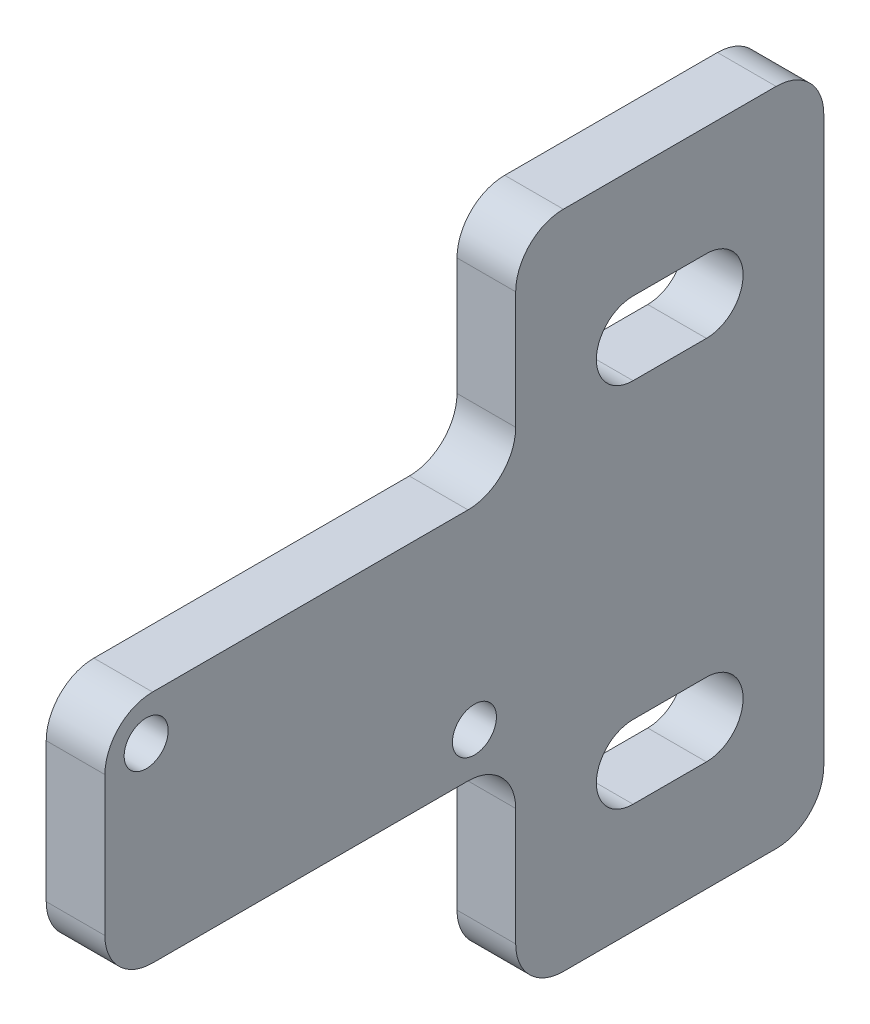
ISO-10303-21;
HEADER;
FILE_DESCRIPTION(('STEP AP214'),'2;1');
FILE_NAME('part.step','',(''),(''),'','','');
FILE_SCHEMA(('AUTOMOTIVE_DESIGN { 1 0 10303 214 1 1 1 1 }'));
ENDSEC;
DATA;
#1=APPLICATION_CONTEXT('core data for automotive mechanical design processes');
#2=APPLICATION_PROTOCOL_DEFINITION('international standard','automotive_design',2000,#1);
#3=PRODUCT_CONTEXT('',#1,'mechanical');
#4=PRODUCT('Part','Part','',(#3));
#5=PRODUCT_RELATED_PRODUCT_CATEGORY('part','',(#4));
#6=PRODUCT_DEFINITION_FORMATION('','',#4);
#7=PRODUCT_DEFINITION_CONTEXT('part definition',#1,'design');
#8=PRODUCT_DEFINITION('design','',#6,#7);
#9=PRODUCT_DEFINITION_SHAPE('','',#8);
#10=(LENGTH_UNIT() NAMED_UNIT(*) SI_UNIT(.MILLI.,.METRE.));
#11=(NAMED_UNIT(*) PLANE_ANGLE_UNIT() SI_UNIT($,.RADIAN.));
#12=(NAMED_UNIT(*) SI_UNIT($,.STERADIAN.) SOLID_ANGLE_UNIT());
#13=UNCERTAINTY_MEASURE_WITH_UNIT(LENGTH_MEASURE(1.E-05),#10,'distance_accuracy_value','');
#14=(GEOMETRIC_REPRESENTATION_CONTEXT(3) GLOBAL_UNCERTAINTY_ASSIGNED_CONTEXT((#13)) GLOBAL_UNIT_ASSIGNED_CONTEXT((#10,
#11,#12)) REPRESENTATION_CONTEXT('',''));
#15=CARTESIAN_POINT('',(0.,0.,0.));
#16=DIRECTION('',(0.,0.,1.));
#17=DIRECTION('',(1.,0.,0.));
#18=AXIS2_PLACEMENT_3D('',#15,#16,#17);
#19=CARTESIAN_POINT('',(4.,-4.5,-13.));
#20=DIRECTION('',(-1.,0.,0.));
#21=DIRECTION('',(0.,0.,1.));
#22=AXIS2_PLACEMENT_3D('',#19,#20,#21);
#23=CYLINDRICAL_SURFACE('',#22,2.5);
#24=CARTESIAN_POINT('',(0.,-4.5,-13.));
#25=DIRECTION('',(1.,0.,0.));
#26=DIRECTION('',(0.,0.,-1.));
#27=AXIS2_PLACEMENT_3D('',#24,#25,#26);
#28=CIRCLE('',#27,2.5);
#29=CARTESIAN_POINT('',(0.,-7.,-13.));
#30=VERTEX_POINT('',#29);
#31=CARTESIAN_POINT('',(0.,-2.,-13.));
#32=VERTEX_POINT('',#31);
#33=EDGE_CURVE('E312',#30,#32,#28,.T.);
#34=ORIENTED_EDGE('',*,*,#33,.F.);
#35=DIRECTION('',(-1.,0.,0.));
#36=VECTOR('',#35,1.);
#37=CARTESIAN_POINT('',(4.,-7.,-13.));
#38=LINE('',#37,#36);
#39=CARTESIAN_POINT('',(4.,-7.,-13.));
#40=VERTEX_POINT('',#39);
#41=EDGE_CURVE('E337',#40,#30,#38,.T.);
#42=ORIENTED_EDGE('',*,*,#41,.F.);
#43=CARTESIAN_POINT('',(4.,-4.5,-13.));
#44=DIRECTION('',(1.,0.,0.));
#45=DIRECTION('',(0.,0.,-1.));
#46=AXIS2_PLACEMENT_3D('',#43,#44,#45);
#47=CIRCLE('',#46,2.5);
#48=CARTESIAN_POINT('',(4.,-2.,-13.));
#49=VERTEX_POINT('',#48);
#50=EDGE_CURVE('E247',#40,#49,#47,.T.);
#51=ORIENTED_EDGE('',*,*,#50,.T.);
#52=DIRECTION('',(-1.,0.,0.));
#53=VECTOR('',#52,1.);
#54=CARTESIAN_POINT('',(4.,-2.,-13.));
#55=LINE('',#54,#53);
#56=EDGE_CURVE('E221',#49,#32,#55,.T.);
#57=ORIENTED_EDGE('',*,*,#56,.T.);
#58=EDGE_LOOP('',(#34,#42,#51,#57));
#59=FACE_BOUND('',#58,.T.);
#60=ADVANCED_FACE('F47',(#59),#23,.F.);
#61=CARTESIAN_POINT('',(4.,-7.,0.));
#62=DIRECTION('',(0.,1.,0.));
#63=DIRECTION('',(0.,0.,1.));
#64=AXIS2_PLACEMENT_3D('',#61,#62,#63);
#65=PLANE('',#64);
#66=DIRECTION('',(0.,0.,-1.));
#67=VECTOR('',#66,1.);
#68=CARTESIAN_POINT('',(0.,-7.,0.));
#69=LINE('',#68,#67);
#70=CARTESIAN_POINT('',(0.,-7.,-8.));
#71=VERTEX_POINT('',#70);
#72=EDGE_CURVE('E316',#71,#30,#69,.T.);
#73=ORIENTED_EDGE('',*,*,#72,.F.);
#74=DIRECTION('',(-1.,0.,0.));
#75=VECTOR('',#74,1.);
#76=CARTESIAN_POINT('',(4.,-7.,-8.));
#77=LINE('',#76,#75);
#78=CARTESIAN_POINT('',(4.,-7.,-8.));
#79=VERTEX_POINT('',#78);
#80=EDGE_CURVE('E334',#79,#71,#77,.T.);
#81=ORIENTED_EDGE('',*,*,#80,.F.);
#82=DIRECTION('',(0.,0.,-1.));
#83=VECTOR('',#82,1.);
#84=CARTESIAN_POINT('',(4.,-7.,0.));
#85=LINE('',#84,#83);
#86=EDGE_CURVE('E251',#79,#40,#85,.T.);
#87=ORIENTED_EDGE('',*,*,#86,.T.);
#88=ORIENTED_EDGE('',*,*,#41,.T.);
#89=EDGE_LOOP('',(#73,#81,#87,#88));
#90=FACE_BOUND('',#89,.T.);
#91=ADVANCED_FACE('F543',(#90),#65,.T.);
#92=CARTESIAN_POINT('',(4.,-4.5,-8.));
#93=DIRECTION('',(-1.,0.,0.));
#94=DIRECTION('',(0.,0.,1.));
#95=AXIS2_PLACEMENT_3D('',#92,#93,#94);
#96=CYLINDRICAL_SURFACE('',#95,2.5);
#97=CARTESIAN_POINT('',(0.,-4.5,-8.));
#98=DIRECTION('',(1.,0.,0.));
#99=DIRECTION('',(0.,0.,-1.));
#100=AXIS2_PLACEMENT_3D('',#97,#98,#99);
#101=CIRCLE('',#100,2.5);
#102=CARTESIAN_POINT('',(0.,-2.,-8.));
#103=VERTEX_POINT('',#102);
#104=EDGE_CURVE('E320',#103,#71,#101,.T.);
#105=ORIENTED_EDGE('',*,*,#104,.F.);
#106=DIRECTION('',(-1.,0.,0.));
#107=VECTOR('',#106,1.);
#108=CARTESIAN_POINT('',(4.,-2.,-8.));
#109=LINE('',#108,#107);
#110=CARTESIAN_POINT('',(4.,-2.,-8.));
#111=VERTEX_POINT('',#110);
#112=EDGE_CURVE('E331',#111,#103,#109,.T.);
#113=ORIENTED_EDGE('',*,*,#112,.F.);
#114=CARTESIAN_POINT('',(4.,-4.5,-8.));
#115=DIRECTION('',(1.,0.,0.));
#116=DIRECTION('',(0.,0.,-1.));
#117=AXIS2_PLACEMENT_3D('',#114,#115,#116);
#118=CIRCLE('',#117,2.5);
#119=EDGE_CURVE('E255',#111,#79,#118,.T.);
#120=ORIENTED_EDGE('',*,*,#119,.T.);
#121=ORIENTED_EDGE('',*,*,#80,.T.);
#122=EDGE_LOOP('',(#105,#113,#120,#121));
#123=FACE_BOUND('',#122,.T.);
#124=ADVANCED_FACE('F549',(#123),#96,.F.);
#125=CARTESIAN_POINT('',(4.,20.5,-13.));
#126=DIRECTION('',(-1.,0.,0.));
#127=DIRECTION('',(0.,0.,1.));
#128=AXIS2_PLACEMENT_3D('',#125,#126,#127);
#129=CYLINDRICAL_SURFACE('',#128,2.50000000000001);
#130=CARTESIAN_POINT('',(0.,20.5,-13.));
#131=DIRECTION('',(1.,0.,0.));
#132=DIRECTION('',(0.,0.,-1.));
#133=AXIS2_PLACEMENT_3D('',#130,#131,#132);
#134=CIRCLE('',#133,2.50000000000001);
#135=CARTESIAN_POINT('',(0.,18.,-13.));
#136=VERTEX_POINT('',#135);
#137=CARTESIAN_POINT('',(0.,23.,-13.));
#138=VERTEX_POINT('',#137);
#139=EDGE_CURVE('E215',#136,#138,#134,.T.);
#140=ORIENTED_EDGE('',*,*,#139,.F.);
#141=DIRECTION('',(-1.,0.,0.));
#142=VECTOR('',#141,1.);
#143=CARTESIAN_POINT('',(4.,18.,-13.));
#144=LINE('',#143,#142);
#145=CARTESIAN_POINT('',(4.,18.,-13.));
#146=VERTEX_POINT('',#145);
#147=EDGE_CURVE('E210',#146,#136,#144,.T.);
#148=ORIENTED_EDGE('',*,*,#147,.F.);
#149=CARTESIAN_POINT('',(4.,20.5,-13.));
#150=DIRECTION('',(1.,0.,0.));
#151=DIRECTION('',(0.,0.,-1.));
#152=AXIS2_PLACEMENT_3D('',#149,#150,#151);
#153=CIRCLE('',#152,2.50000000000001);
#154=CARTESIAN_POINT('',(4.,23.,-13.));
#155=VERTEX_POINT('',#154);
#156=EDGE_CURVE('E213',#146,#155,#153,.T.);
#157=ORIENTED_EDGE('',*,*,#156,.T.);
#158=DIRECTION('',(-1.,0.,0.));
#159=VECTOR('',#158,1.);
#160=CARTESIAN_POINT('',(4.,23.,-13.));
#161=LINE('',#160,#159);
#162=EDGE_CURVE('E262',#155,#138,#161,.T.);
#163=ORIENTED_EDGE('',*,*,#162,.T.);
#164=EDGE_LOOP('',(#140,#148,#157,#163));
#165=FACE_BOUND('',#164,.T.);
#166=ADVANCED_FACE('F212',(#165),#129,.F.);
#167=CARTESIAN_POINT('',(4.,18.,0.));
#168=DIRECTION('',(0.,1.,0.));
#169=DIRECTION('',(0.,0.,1.));
#170=AXIS2_PLACEMENT_3D('',#167,#168,#169);
#171=PLANE('',#170);
#172=DIRECTION('',(0.,0.,-1.));
#173=VECTOR('',#172,1.);
#174=CARTESIAN_POINT('',(0.,18.,0.));
#175=LINE('',#174,#173);
#176=CARTESIAN_POINT('',(0.,18.,-8.));
#177=VERTEX_POINT('',#176);
#178=EDGE_CURVE('E301',#177,#136,#175,.T.);
#179=ORIENTED_EDGE('',*,*,#178,.F.);
#180=DIRECTION('',(-1.,0.,0.));
#181=VECTOR('',#180,1.);
#182=CARTESIAN_POINT('',(4.,18.,-8.));
#183=LINE('',#182,#181);
#184=CARTESIAN_POINT('',(4.,18.,-8.));
#185=VERTEX_POINT('',#184);
#186=EDGE_CURVE('E222',#185,#177,#183,.T.);
#187=ORIENTED_EDGE('',*,*,#186,.F.);
#188=DIRECTION('',(0.,0.,-1.));
#189=VECTOR('',#188,1.);
#190=CARTESIAN_POINT('',(4.,18.,0.));
#191=LINE('',#190,#189);
#192=EDGE_CURVE('E229',#185,#146,#191,.T.);
#193=ORIENTED_EDGE('',*,*,#192,.T.);
#194=ORIENTED_EDGE('',*,*,#147,.T.);
#195=EDGE_LOOP('',(#179,#187,#193,#194));
#196=FACE_BOUND('',#195,.T.);
#197=ADVANCED_FACE('F237',(#196),#171,.T.);
#198=CARTESIAN_POINT('',(4.,20.5,-8.));
#199=DIRECTION('',(-1.,0.,0.));
#200=DIRECTION('',(0.,0.,1.));
#201=AXIS2_PLACEMENT_3D('',#198,#199,#200);
#202=CYLINDRICAL_SURFACE('',#201,2.50000000000001);
#203=CARTESIAN_POINT('',(0.,20.5,-8.));
#204=DIRECTION('',(1.,0.,0.));
#205=DIRECTION('',(0.,0.,-1.));
#206=AXIS2_PLACEMENT_3D('',#203,#204,#205);
#207=CIRCLE('',#206,2.50000000000001);
#208=CARTESIAN_POINT('',(0.,23.,-8.));
#209=VERTEX_POINT('',#208);
#210=EDGE_CURVE('E304',#209,#177,#207,.T.);
#211=ORIENTED_EDGE('',*,*,#210,.F.);
#212=DIRECTION('',(-1.,0.,0.));
#213=VECTOR('',#212,1.);
#214=CARTESIAN_POINT('',(4.,23.,-8.));
#215=LINE('',#214,#213);
#216=CARTESIAN_POINT('',(4.,23.,-8.));
#217=VERTEX_POINT('',#216);
#218=EDGE_CURVE('E343',#217,#209,#215,.T.);
#219=ORIENTED_EDGE('',*,*,#218,.F.);
#220=CARTESIAN_POINT('',(4.,20.5,-8.));
#221=DIRECTION('',(1.,0.,0.));
#222=DIRECTION('',(0.,0.,-1.));
#223=AXIS2_PLACEMENT_3D('',#220,#221,#222);
#224=CIRCLE('',#223,2.50000000000001);
#225=EDGE_CURVE('E239',#217,#185,#224,.T.);
#226=ORIENTED_EDGE('',*,*,#225,.T.);
#227=ORIENTED_EDGE('',*,*,#186,.T.);
#228=EDGE_LOOP('',(#211,#219,#226,#227));
#229=FACE_BOUND('',#228,.T.);
#230=ADVANCED_FACE('F559',(#229),#202,.F.);
#231=CARTESIAN_POINT('',(4.,0.,0.));
#232=DIRECTION('',(0.,-1.,0.));
#233=DIRECTION('',(0.,0.,-1.));
#234=AXIS2_PLACEMENT_3D('',#231,#232,#233);
#235=PLANE('',#234);
#236=DIRECTION('',(0.,0.,1.));
#237=VECTOR('',#236,1.);
#238=CARTESIAN_POINT('',(4.,0.,0.));
#239=LINE('',#238,#237);
#240=CARTESIAN_POINT('',(4.,0.,3.25));
#241=VERTEX_POINT('',#240);
#242=CARTESIAN_POINT('',(4.,0.,24.75));
#243=VERTEX_POINT('',#242);
#244=EDGE_CURVE('E463',#241,#243,#239,.T.);
#245=ORIENTED_EDGE('',*,*,#244,.T.);
#246=DIRECTION('',(-1.,0.,0.));
#247=VECTOR('',#246,1.);
#248=CARTESIAN_POINT('',(4.,0.,24.75));
#249=LINE('',#248,#247);
#250=CARTESIAN_POINT('',(0.,0.,24.75));
#251=VERTEX_POINT('',#250);
#252=EDGE_CURVE('E350',#243,#251,#249,.T.);
#253=ORIENTED_EDGE('',*,*,#252,.T.);
#254=DIRECTION('',(0.,0.,1.));
#255=VECTOR('',#254,1.);
#256=CARTESIAN_POINT('',(0.,0.,0.));
#257=LINE('',#256,#255);
#258=CARTESIAN_POINT('',(0.,0.,3.25));
#259=VERTEX_POINT('',#258);
#260=EDGE_CURVE('E271',#259,#251,#257,.T.);
#261=ORIENTED_EDGE('',*,*,#260,.F.);
#262=DIRECTION('',(-1.,0.,0.));
#263=VECTOR('',#262,1.);
#264=CARTESIAN_POINT('',(4.,0.,3.25));
#265=LINE('',#264,#263);
#266=EDGE_CURVE('E340',#259,#241,#265,.F.);
#267=ORIENTED_EDGE('',*,*,#266,.T.);
#268=EDGE_LOOP('',(#245,#253,#261,#267));
#269=FACE_BOUND('',#268,.T.);
#270=ADVANCED_FACE('F453',(#269),#235,.T.);
#271=CARTESIAN_POINT('',(4.,0.,0.));
#272=DIRECTION('',(0.,0.,1.));
#273=DIRECTION('',(1.,0.,0.));
#274=AXIS2_PLACEMENT_3D('',#271,#272,#273);
#275=PLANE('',#274);
#276=DIRECTION('',(0.,1.,0.));
#277=VECTOR('',#276,1.);
#278=CARTESIAN_POINT('',(0.,0.,0.));
#279=LINE('',#278,#277);
#280=CARTESIAN_POINT('',(0.,-11.25,0.));
#281=VERTEX_POINT('',#280);
#282=CARTESIAN_POINT('',(0.,-3.25,0.));
#283=VERTEX_POINT('',#282);
#284=EDGE_CURVE('E275',#281,#283,#279,.T.);
#285=ORIENTED_EDGE('',*,*,#284,.F.);
#286=DIRECTION('',(-1.,0.,0.));
#287=VECTOR('',#286,1.);
#288=CARTESIAN_POINT('',(4.,-11.25,0.));
#289=LINE('',#288,#287);
#290=CARTESIAN_POINT('',(4.,-11.25,0.));
#291=VERTEX_POINT('',#290);
#292=EDGE_CURVE('E435',#281,#291,#289,.F.);
#293=ORIENTED_EDGE('',*,*,#292,.T.);
#294=DIRECTION('',(0.,1.,0.));
#295=VECTOR('',#294,1.);
#296=CARTESIAN_POINT('',(4.,0.,0.));
#297=LINE('',#296,#295);
#298=CARTESIAN_POINT('',(4.,-3.25,0.));
#299=VERTEX_POINT('',#298);
#300=EDGE_CURVE('E461',#291,#299,#297,.T.);
#301=ORIENTED_EDGE('',*,*,#300,.T.);
#302=DIRECTION('',(-1.,0.,0.));
#303=VECTOR('',#302,1.);
#304=CARTESIAN_POINT('',(0.,-3.25,0.));
#305=LINE('',#304,#303);
#306=EDGE_CURVE('E431',#299,#283,#305,.T.);
#307=ORIENTED_EDGE('',*,*,#306,.T.);
#308=EDGE_LOOP('',(#285,#293,#301,#307));
#309=FACE_BOUND('',#308,.T.);
#310=ADVANCED_FACE('F465',(#309),#275,.T.);
#311=CARTESIAN_POINT('',(4.,-14.5,0.));
#312=DIRECTION('',(0.,1.,0.));
#313=DIRECTION('',(0.,0.,1.));
#314=AXIS2_PLACEMENT_3D('',#311,#312,#313);
#315=PLANE('',#314);
#316=DIRECTION('',(0.,0.,-1.));
#317=VECTOR('',#316,1.);
#318=CARTESIAN_POINT('',(0.,-14.5,0.));
#319=LINE('',#318,#317);
#320=CARTESIAN_POINT('',(0.,-14.5,-3.25));
#321=VERTEX_POINT('',#320);
#322=CARTESIAN_POINT('',(0.,-14.5,-17.75));
#323=VERTEX_POINT('',#322);
#324=EDGE_CURVE('E279',#321,#323,#319,.T.);
#325=ORIENTED_EDGE('',*,*,#324,.T.);
#326=DIRECTION('',(-1.,0.,0.));
#327=VECTOR('',#326,1.);
#328=CARTESIAN_POINT('',(4.,-14.5,-17.75));
#329=LINE('',#328,#327);
#330=CARTESIAN_POINT('',(4.,-14.5,-17.75));
#331=VERTEX_POINT('',#330);
#332=EDGE_CURVE('E428',#323,#331,#329,.F.);
#333=ORIENTED_EDGE('',*,*,#332,.T.);
#334=DIRECTION('',(0.,0.,-1.));
#335=VECTOR('',#334,1.);
#336=CARTESIAN_POINT('',(4.,-14.5,0.));
#337=LINE('',#336,#335);
#338=CARTESIAN_POINT('',(4.,-14.5,-3.25));
#339=VERTEX_POINT('',#338);
#340=EDGE_CURVE('E468',#339,#331,#337,.T.);
#341=ORIENTED_EDGE('',*,*,#340,.F.);
#342=DIRECTION('',(-1.,0.,0.));
#343=VECTOR('',#342,1.);
#344=CARTESIAN_POINT('',(0.,-14.5,-3.25));
#345=LINE('',#344,#343);
#346=EDGE_CURVE('E424',#339,#321,#345,.T.);
#347=ORIENTED_EDGE('',*,*,#346,.T.);
#348=EDGE_LOOP('',(#325,#333,#341,#347));
#349=FACE_BOUND('',#348,.T.);
#350=ADVANCED_FACE('F578',(#349),#315,.F.);
#351=CARTESIAN_POINT('',(4.,0.,-21.));
#352=DIRECTION('',(0.,0.,1.));
#353=DIRECTION('',(1.,0.,0.));
#354=AXIS2_PLACEMENT_3D('',#351,#352,#353);
#355=PLANE('',#354);
#356=DIRECTION('',(0.,1.,0.));
#357=VECTOR('',#356,1.);
#358=CARTESIAN_POINT('',(0.,0.,-21.));
#359=LINE('',#358,#357);
#360=CARTESIAN_POINT('',(0.,-11.25,-21.));
#361=VERTEX_POINT('',#360);
#362=CARTESIAN_POINT('',(0.,27.25,-21.));
#363=VERTEX_POINT('',#362);
#364=EDGE_CURVE('E284',#361,#363,#359,.T.);
#365=ORIENTED_EDGE('',*,*,#364,.T.);
#366=DIRECTION('',(-1.,0.,0.));
#367=VECTOR('',#366,1.);
#368=CARTESIAN_POINT('',(4.,27.25,-21.));
#369=LINE('',#368,#367);
#370=CARTESIAN_POINT('',(4.,27.25,-21.));
#371=VERTEX_POINT('',#370);
#372=EDGE_CURVE('E421',#363,#371,#369,.F.);
#373=ORIENTED_EDGE('',*,*,#372,.T.);
#374=DIRECTION('',(0.,1.,0.));
#375=VECTOR('',#374,1.);
#376=CARTESIAN_POINT('',(4.,0.,-21.));
#377=LINE('',#376,#375);
#378=CARTESIAN_POINT('',(4.,-11.25,-21.));
#379=VERTEX_POINT('',#378);
#380=EDGE_CURVE('E474',#379,#371,#377,.T.);
#381=ORIENTED_EDGE('',*,*,#380,.F.);
#382=DIRECTION('',(-1.,0.,0.));
#383=VECTOR('',#382,1.);
#384=CARTESIAN_POINT('',(4.,-11.25,-21.));
#385=LINE('',#384,#383);
#386=EDGE_CURVE('E417',#379,#361,#385,.T.);
#387=ORIENTED_EDGE('',*,*,#386,.T.);
#388=EDGE_LOOP('',(#365,#373,#381,#387));
#389=FACE_BOUND('',#388,.T.);
#390=ADVANCED_FACE('F575',(#389),#355,.F.);
#391=CARTESIAN_POINT('',(4.,30.5,0.));
#392=DIRECTION('',(0.,1.,0.));
#393=DIRECTION('',(0.,0.,1.));
#394=AXIS2_PLACEMENT_3D('',#391,#392,#393);
#395=PLANE('',#394);
#396=DIRECTION('',(0.,0.,-1.));
#397=VECTOR('',#396,1.);
#398=CARTESIAN_POINT('',(0.,30.5,0.));
#399=LINE('',#398,#397);
#400=CARTESIAN_POINT('',(0.,30.5,-3.25));
#401=VERTEX_POINT('',#400);
#402=CARTESIAN_POINT('',(0.,30.5,-17.75));
#403=VERTEX_POINT('',#402);
#404=EDGE_CURVE('E288',#401,#403,#399,.T.);
#405=ORIENTED_EDGE('',*,*,#404,.F.);
#406=DIRECTION('',(-1.,0.,0.));
#407=VECTOR('',#406,1.);
#408=CARTESIAN_POINT('',(4.,30.5,-3.25));
#409=LINE('',#408,#407);
#410=CARTESIAN_POINT('',(4.,30.5,-3.25));
#411=VERTEX_POINT('',#410);
#412=EDGE_CURVE('E414',#401,#411,#409,.F.);
#413=ORIENTED_EDGE('',*,*,#412,.T.);
#414=DIRECTION('',(0.,0.,-1.));
#415=VECTOR('',#414,1.);
#416=CARTESIAN_POINT('',(4.,30.5,0.));
#417=LINE('',#416,#415);
#418=CARTESIAN_POINT('',(4.,30.5,-17.75));
#419=VERTEX_POINT('',#418);
#420=EDGE_CURVE('E481',#411,#419,#417,.T.);
#421=ORIENTED_EDGE('',*,*,#420,.T.);
#422=DIRECTION('',(-1.,0.,0.));
#423=VECTOR('',#422,1.);
#424=CARTESIAN_POINT('',(0.,30.5,-17.75));
#425=LINE('',#424,#423);
#426=EDGE_CURVE('E410',#419,#403,#425,.T.);
#427=ORIENTED_EDGE('',*,*,#426,.T.);
#428=EDGE_LOOP('',(#405,#413,#421,#427));
#429=FACE_BOUND('',#428,.T.);
#430=ADVANCED_FACE('F572',(#429),#395,.T.);
#431=CARTESIAN_POINT('',(0.,19.25,0.));
#432=VERTEX_POINT('',#431);
#433=CARTESIAN_POINT('',(0.,27.25,0.));
#434=VERTEX_POINT('',#433);
#435=EDGE_CURVE('E280',#432,#434,#279,.T.);
#436=ORIENTED_EDGE('',*,*,#435,.F.);
#437=DIRECTION('',(-1.,0.,0.));
#438=VECTOR('',#437,1.);
#439=CARTESIAN_POINT('',(4.,19.25,0.));
#440=LINE('',#439,#438);
#441=CARTESIAN_POINT('',(4.,19.25,0.));
#442=VERTEX_POINT('',#441);
#443=EDGE_CURVE('E407',#432,#442,#440,.F.);
#444=ORIENTED_EDGE('',*,*,#443,.T.);
#445=CARTESIAN_POINT('',(4.,27.25,0.));
#446=VERTEX_POINT('',#445);
#447=EDGE_CURVE('E470',#442,#446,#297,.T.);
#448=ORIENTED_EDGE('',*,*,#447,.T.);
#449=DIRECTION('',(-1.,0.,0.));
#450=VECTOR('',#449,1.);
#451=CARTESIAN_POINT('',(4.,27.25,0.));
#452=LINE('',#451,#450);
#453=EDGE_CURVE('E403',#446,#434,#452,.T.);
#454=ORIENTED_EDGE('',*,*,#453,.T.);
#455=EDGE_LOOP('',(#436,#444,#448,#454));
#456=FACE_BOUND('',#455,.T.);
#457=ADVANCED_FACE('F513',(#456),#275,.T.);
#458=CARTESIAN_POINT('',(4.,16.,0.));
#459=DIRECTION('',(0.,-1.,0.));
#460=DIRECTION('',(0.,0.,-1.));
#461=AXIS2_PLACEMENT_3D('',#458,#459,#460);
#462=PLANE('',#461);
#463=DIRECTION('',(0.,0.,1.));
#464=VECTOR('',#463,1.);
#465=CARTESIAN_POINT('',(4.,16.,0.));
#466=LINE('',#465,#464);
#467=CARTESIAN_POINT('',(4.,16.,3.25));
#468=VERTEX_POINT('',#467);
#469=CARTESIAN_POINT('',(4.,16.,24.75));
#470=VERTEX_POINT('',#469);
#471=EDGE_CURVE('E480',#468,#470,#466,.T.);
#472=ORIENTED_EDGE('',*,*,#471,.F.);
#473=DIRECTION('',(-1.,0.,0.));
#474=VECTOR('',#473,1.);
#475=CARTESIAN_POINT('',(4.,16.,3.25));
#476=LINE('',#475,#474);
#477=CARTESIAN_POINT('',(0.,16.,3.25));
#478=VERTEX_POINT('',#477);
#479=EDGE_CURVE('E399',#468,#478,#476,.T.);
#480=ORIENTED_EDGE('',*,*,#479,.T.);
#481=DIRECTION('',(0.,0.,1.));
#482=VECTOR('',#481,1.);
#483=CARTESIAN_POINT('',(0.,16.,0.));
#484=LINE('',#483,#482);
#485=CARTESIAN_POINT('',(0.,16.,24.75));
#486=VERTEX_POINT('',#485);
#487=EDGE_CURVE('E292',#478,#486,#484,.T.);
#488=ORIENTED_EDGE('',*,*,#487,.T.);
#489=DIRECTION('',(-1.,0.,0.));
#490=VECTOR('',#489,1.);
#491=CARTESIAN_POINT('',(4.,16.,24.75));
#492=LINE('',#491,#490);
#493=EDGE_CURVE('E63',#486,#470,#492,.F.);
#494=ORIENTED_EDGE('',*,*,#493,.T.);
#495=EDGE_LOOP('',(#472,#480,#488,#494));
#496=FACE_BOUND('',#495,.T.);
#497=ADVANCED_FACE('F506',(#496),#462,.F.);
#498=CARTESIAN_POINT('',(4.,23.,0.));
#499=DIRECTION('',(0.,1.,0.));
#500=DIRECTION('',(0.,0.,1.));
#501=AXIS2_PLACEMENT_3D('',#498,#499,#500);
#502=PLANE('',#501);
#503=DIRECTION('',(0.,0.,-1.));
#504=VECTOR('',#503,1.);
#505=CARTESIAN_POINT('',(0.,23.,0.));
#506=LINE('',#505,#504);
#507=EDGE_CURVE('E308',#209,#138,#506,.T.);
#508=ORIENTED_EDGE('',*,*,#507,.T.);
#509=ORIENTED_EDGE('',*,*,#162,.F.);
#510=DIRECTION('',(0.,0.,-1.));
#511=VECTOR('',#510,1.);
#512=CARTESIAN_POINT('',(4.,23.,0.));
#513=LINE('',#512,#511);
#514=EDGE_CURVE('E232',#217,#155,#513,.T.);
#515=ORIENTED_EDGE('',*,*,#514,.F.);
#516=ORIENTED_EDGE('',*,*,#218,.T.);
#517=EDGE_LOOP('',(#508,#509,#515,#516));
#518=FACE_BOUND('',#517,.T.);
#519=ADVANCED_FACE('F555',(#518),#502,.F.);
#520=CARTESIAN_POINT('',(4.,0.,28.));
#521=DIRECTION('',(0.,0.,1.));
#522=DIRECTION('',(1.,0.,0.));
#523=AXIS2_PLACEMENT_3D('',#520,#521,#522);
#524=PLANE('',#523);
#525=DIRECTION('',(0.,1.,0.));
#526=VECTOR('',#525,1.);
#527=CARTESIAN_POINT('',(0.,0.,28.));
#528=LINE('',#527,#526);
#529=CARTESIAN_POINT('',(0.,3.25,28.));
#530=VERTEX_POINT('',#529);
#531=CARTESIAN_POINT('',(0.,12.75,28.));
#532=VERTEX_POINT('',#531);
#533=EDGE_CURVE('E295',#530,#532,#528,.T.);
#534=ORIENTED_EDGE('',*,*,#533,.F.);
#535=DIRECTION('',(-1.,0.,0.));
#536=VECTOR('',#535,1.);
#537=CARTESIAN_POINT('',(4.,3.25,28.));
#538=LINE('',#537,#536);
#539=CARTESIAN_POINT('',(4.,3.25,28.));
#540=VERTEX_POINT('',#539);
#541=EDGE_CURVE('E376',#530,#540,#538,.F.);
#542=ORIENTED_EDGE('',*,*,#541,.T.);
#543=DIRECTION('',(0.,1.,0.));
#544=VECTOR('',#543,1.);
#545=CARTESIAN_POINT('',(4.,0.,28.));
#546=LINE('',#545,#544);
#547=CARTESIAN_POINT('',(4.,12.75,28.));
#548=VERTEX_POINT('',#547);
#549=EDGE_CURVE('E235',#540,#548,#546,.T.);
#550=ORIENTED_EDGE('',*,*,#549,.T.);
#551=DIRECTION('',(-1.,0.,0.));
#552=VECTOR('',#551,1.);
#553=CARTESIAN_POINT('',(0.,12.75,28.));
#554=LINE('',#553,#552);
#555=EDGE_CURVE('E372',#548,#532,#554,.T.);
#556=ORIENTED_EDGE('',*,*,#555,.T.);
#557=EDGE_LOOP('',(#534,#542,#550,#556));
#558=FACE_BOUND('',#557,.T.);
#559=ADVANCED_FACE('F500',(#558),#524,.T.);
#560=CARTESIAN_POINT('',(4.,13.1872469792167,25.1872469792167));
#561=DIRECTION('',(-1.,0.,0.));
#562=DIRECTION('',(0.,0.,1.));
#563=AXIS2_PLACEMENT_3D('',#560,#561,#562);
#564=CYLINDRICAL_SURFACE('',#563,1.5);
#565=CARTESIAN_POINT('',(4.,13.1872469792167,25.1872469792167));
#566=DIRECTION('',(1.,0.,0.));
#567=DIRECTION('',(0.,0.,-1.));
#568=AXIS2_PLACEMENT_3D('',#565,#566,#567);
#569=CIRCLE('',#568,1.5);
#570=CARTESIAN_POINT('',(4.,13.1872469792167,23.6872469792167));
#571=VERTEX_POINT('',#570);
#572=EDGE_CURVE('E476',#571,#571,#569,.T.);
#573=ORIENTED_EDGE('',*,*,#572,.T.);
#574=EDGE_LOOP('',(#573));
#575=FACE_BOUND('',#574,.T.);
#576=CARTESIAN_POINT('',(0.,13.1872469792167,25.1872469792167));
#577=DIRECTION('',(1.,0.,0.));
#578=DIRECTION('',(0.,0.,-1.));
#579=AXIS2_PLACEMENT_3D('',#576,#577,#578);
#580=CIRCLE('',#579,1.5);
#581=CARTESIAN_POINT('',(0.,13.1872469792167,23.6872469792167));
#582=VERTEX_POINT('',#581);
#583=EDGE_CURVE('E267',#582,#582,#580,.T.);
#584=ORIENTED_EDGE('',*,*,#583,.F.);
#585=EDGE_LOOP('',(#584));
#586=FACE_BOUND('',#585,.T.);
#587=ADVANCED_FACE('F523',(#575,#586),#564,.F.);
#588=CARTESIAN_POINT('',(4.,2.81275302078325,2.81275302078325));
#589=DIRECTION('',(-1.,0.,0.));
#590=DIRECTION('',(0.,0.,1.));
#591=AXIS2_PLACEMENT_3D('',#588,#589,#590);
#592=CYLINDRICAL_SURFACE('',#591,1.5);
#593=CARTESIAN_POINT('',(4.,2.81275302078325,2.81275302078325));
#594=DIRECTION('',(1.,0.,0.));
#595=DIRECTION('',(0.,0.,-1.));
#596=AXIS2_PLACEMENT_3D('',#593,#594,#595);
#597=CIRCLE('',#596,1.5);
#598=CARTESIAN_POINT('',(4.,2.81275302078325,1.31275302078325));
#599=VERTEX_POINT('',#598);
#600=EDGE_CURVE('E328',#599,#599,#597,.T.);
#601=ORIENTED_EDGE('',*,*,#600,.T.);
#602=EDGE_LOOP('',(#601));
#603=FACE_BOUND('',#602,.T.);
#604=CARTESIAN_POINT('',(0.,2.81275302078325,2.81275302078325));
#605=DIRECTION('',(1.,0.,0.));
#606=DIRECTION('',(0.,0.,-1.));
#607=AXIS2_PLACEMENT_3D('',#604,#605,#606);
#608=CIRCLE('',#607,1.5);
#609=CARTESIAN_POINT('',(0.,2.81275302078325,1.31275302078325));
#610=VERTEX_POINT('',#609);
#611=EDGE_CURVE('E263',#610,#610,#608,.T.);
#612=ORIENTED_EDGE('',*,*,#611,.F.);
#613=EDGE_LOOP('',(#612));
#614=FACE_BOUND('',#613,.T.);
#615=ADVANCED_FACE('F538',(#603,#614),#592,.F.);
#616=CARTESIAN_POINT('',(4.,-2.,0.));
#617=DIRECTION('',(0.,1.,0.));
#618=DIRECTION('',(0.,0.,1.));
#619=AXIS2_PLACEMENT_3D('',#616,#617,#618);
#620=PLANE('',#619);
#621=DIRECTION('',(0.,0.,-1.));
#622=VECTOR('',#621,1.);
#623=CARTESIAN_POINT('',(0.,-2.,0.));
#624=LINE('',#623,#622);
#625=EDGE_CURVE('E324',#103,#32,#624,.T.);
#626=ORIENTED_EDGE('',*,*,#625,.T.);
#627=ORIENTED_EDGE('',*,*,#56,.F.);
#628=DIRECTION('',(0.,0.,-1.));
#629=VECTOR('',#628,1.);
#630=CARTESIAN_POINT('',(4.,-2.,0.));
#631=LINE('',#630,#629);
#632=EDGE_CURVE('E259',#111,#49,#631,.T.);
#633=ORIENTED_EDGE('',*,*,#632,.F.);
#634=ORIENTED_EDGE('',*,*,#112,.T.);
#635=EDGE_LOOP('',(#626,#627,#633,#634));
#636=FACE_BOUND('',#635,.T.);
#637=ADVANCED_FACE('F527',(#636),#620,.F.);
#638=CARTESIAN_POINT('',(4.,0.,0.));
#639=DIRECTION('',(1.,0.,0.));
#640=DIRECTION('',(0.,0.,-1.));
#641=AXIS2_PLACEMENT_3D('',#638,#639,#640);
#642=PLANE('',#641);
#643=ORIENTED_EDGE('',*,*,#600,.F.);
#644=EDGE_LOOP('',(#643));
#645=FACE_BOUND('',#644,.T.);
#646=ORIENTED_EDGE('',*,*,#572,.F.);
#647=EDGE_LOOP('',(#646));
#648=FACE_BOUND('',#647,.T.);
#649=ORIENTED_EDGE('',*,*,#549,.F.);
#650=CARTESIAN_POINT('',(4.,3.25,24.75));
#651=DIRECTION('',(1.,0.,0.));
#652=DIRECTION('',(0.,0.,-1.));
#653=AXIS2_PLACEMENT_3D('',#650,#651,#652);
#654=CIRCLE('',#653,3.25);
#655=EDGE_CURVE('E394',#540,#243,#654,.T.);
#656=ORIENTED_EDGE('',*,*,#655,.T.);
#657=ORIENTED_EDGE('',*,*,#244,.F.);
#658=CARTESIAN_POINT('',(4.,-3.25,3.25));
#659=DIRECTION('',(1.,0.,0.));
#660=DIRECTION('',(0.,0.,-1.));
#661=AXIS2_PLACEMENT_3D('',#658,#659,#660);
#662=CIRCLE('',#661,3.25);
#663=EDGE_CURVE('E11',#241,#299,#662,.F.);
#664=ORIENTED_EDGE('',*,*,#663,.T.);
#665=ORIENTED_EDGE('',*,*,#300,.F.);
#666=CARTESIAN_POINT('',(4.,-11.25,-3.25));
#667=DIRECTION('',(1.,0.,0.));
#668=DIRECTION('',(0.,0.,-1.));
#669=AXIS2_PLACEMENT_3D('',#666,#667,#668);
#670=CIRCLE('',#669,3.25);
#671=EDGE_CURVE('E382',#291,#339,#670,.T.);
#672=ORIENTED_EDGE('',*,*,#671,.T.);
#673=ORIENTED_EDGE('',*,*,#340,.T.);
#674=CARTESIAN_POINT('',(4.,-11.25,-17.75));
#675=DIRECTION('',(1.,0.,0.));
#676=DIRECTION('',(0.,0.,-1.));
#677=AXIS2_PLACEMENT_3D('',#674,#675,#676);
#678=CIRCLE('',#677,3.25);
#679=EDGE_CURVE('E385',#331,#379,#678,.T.);
#680=ORIENTED_EDGE('',*,*,#679,.T.);
#681=ORIENTED_EDGE('',*,*,#380,.T.);
#682=CARTESIAN_POINT('',(4.,27.25,-17.75));
#683=DIRECTION('',(1.,0.,0.));
#684=DIRECTION('',(0.,0.,-1.));
#685=AXIS2_PLACEMENT_3D('',#682,#683,#684);
#686=CIRCLE('',#685,3.25);
#687=EDGE_CURVE('E388',#371,#419,#686,.T.);
#688=ORIENTED_EDGE('',*,*,#687,.T.);
#689=ORIENTED_EDGE('',*,*,#420,.F.);
#690=CARTESIAN_POINT('',(4.,27.25,-3.25));
#691=DIRECTION('',(1.,0.,0.));
#692=DIRECTION('',(0.,0.,-1.));
#693=AXIS2_PLACEMENT_3D('',#690,#691,#692);
#694=CIRCLE('',#693,3.25);
#695=EDGE_CURVE('E391',#411,#446,#694,.T.);
#696=ORIENTED_EDGE('',*,*,#695,.T.);
#697=ORIENTED_EDGE('',*,*,#447,.F.);
#698=CARTESIAN_POINT('',(4.,19.25,3.25));
#699=DIRECTION('',(1.,0.,0.));
#700=DIRECTION('',(0.,0.,-1.));
#701=AXIS2_PLACEMENT_3D('',#698,#699,#700);
#702=CIRCLE('',#701,3.25);
#703=EDGE_CURVE('E70',#442,#468,#702,.F.);
#704=ORIENTED_EDGE('',*,*,#703,.T.);
#705=ORIENTED_EDGE('',*,*,#471,.T.);
#706=CARTESIAN_POINT('',(4.,12.75,24.75));
#707=DIRECTION('',(1.,0.,0.));
#708=DIRECTION('',(0.,0.,-1.));
#709=AXIS2_PLACEMENT_3D('',#706,#707,#708);
#710=CIRCLE('',#709,3.25);
#711=EDGE_CURVE('E379',#470,#548,#710,.T.);
#712=ORIENTED_EDGE('',*,*,#711,.T.);
#713=EDGE_LOOP('',(#649,#656,#657,#664,#665,#672,#673,#680,#681,#688,#689,#696,#697,#704,#705,#712));
#714=FACE_BOUND('',#713,.T.);
#715=ORIENTED_EDGE('',*,*,#156,.F.);
#716=ORIENTED_EDGE('',*,*,#192,.F.);
#717=ORIENTED_EDGE('',*,*,#225,.F.);
#718=ORIENTED_EDGE('',*,*,#514,.T.);
#719=EDGE_LOOP('',(#715,#716,#717,#718));
#720=FACE_BOUND('',#719,.T.);
#721=ORIENTED_EDGE('',*,*,#50,.F.);
#722=ORIENTED_EDGE('',*,*,#86,.F.);
#723=ORIENTED_EDGE('',*,*,#119,.F.);
#724=ORIENTED_EDGE('',*,*,#632,.T.);
#725=EDGE_LOOP('',(#721,#722,#723,#724));
#726=FACE_BOUND('',#725,.T.);
#727=ADVANCED_FACE('F226',(#645,#648,#714,#720,#726),#642,.T.);
#728=CARTESIAN_POINT('',(0.,0.,0.));
#729=DIRECTION('',(1.,0.,0.));
#730=DIRECTION('',(0.,0.,-1.));
#731=AXIS2_PLACEMENT_3D('',#728,#729,#730);
#732=PLANE('',#731);
#733=ORIENTED_EDGE('',*,*,#611,.T.);
#734=EDGE_LOOP('',(#733));
#735=FACE_BOUND('',#734,.T.);
#736=ORIENTED_EDGE('',*,*,#583,.T.);
#737=EDGE_LOOP('',(#736));
#738=FACE_BOUND('',#737,.T.);
#739=ORIENTED_EDGE('',*,*,#260,.T.);
#740=CARTESIAN_POINT('',(0.,3.25,24.75));
#741=DIRECTION('',(1.,0.,0.));
#742=DIRECTION('',(0.,0.,-1.));
#743=AXIS2_PLACEMENT_3D('',#740,#741,#742);
#744=CIRCLE('',#743,3.25);
#745=EDGE_CURVE('E369',#251,#530,#744,.F.);
#746=ORIENTED_EDGE('',*,*,#745,.T.);
#747=ORIENTED_EDGE('',*,*,#533,.T.);
#748=CARTESIAN_POINT('',(0.,12.75,24.75));
#749=DIRECTION('',(1.,0.,0.));
#750=DIRECTION('',(0.,0.,-1.));
#751=AXIS2_PLACEMENT_3D('',#748,#749,#750);
#752=CIRCLE('',#751,3.25);
#753=EDGE_CURVE('E354',#532,#486,#752,.F.);
#754=ORIENTED_EDGE('',*,*,#753,.T.);
#755=ORIENTED_EDGE('',*,*,#487,.F.);
#756=CARTESIAN_POINT('',(0.,19.25,3.25));
#757=DIRECTION('',(1.,0.,0.));
#758=DIRECTION('',(0.,0.,-1.));
#759=AXIS2_PLACEMENT_3D('',#756,#757,#758);
#760=CIRCLE('',#759,3.25);
#761=EDGE_CURVE('E438',#478,#432,#760,.T.);
#762=ORIENTED_EDGE('',*,*,#761,.T.);
#763=ORIENTED_EDGE('',*,*,#435,.T.);
#764=CARTESIAN_POINT('',(0.,27.25,-3.25));
#765=DIRECTION('',(1.,0.,0.));
#766=DIRECTION('',(0.,0.,-1.));
#767=AXIS2_PLACEMENT_3D('',#764,#765,#766);
#768=CIRCLE('',#767,3.25);
#769=EDGE_CURVE('E366',#434,#401,#768,.F.);
#770=ORIENTED_EDGE('',*,*,#769,.T.);
#771=ORIENTED_EDGE('',*,*,#404,.T.);
#772=CARTESIAN_POINT('',(0.,27.25,-17.75));
#773=DIRECTION('',(1.,0.,0.));
#774=DIRECTION('',(0.,0.,-1.));
#775=AXIS2_PLACEMENT_3D('',#772,#773,#774);
#776=CIRCLE('',#775,3.25);
#777=EDGE_CURVE('E363',#403,#363,#776,.F.);
#778=ORIENTED_EDGE('',*,*,#777,.T.);
#779=ORIENTED_EDGE('',*,*,#364,.F.);
#780=CARTESIAN_POINT('',(0.,-11.25,-17.75));
#781=DIRECTION('',(1.,0.,0.));
#782=DIRECTION('',(0.,0.,-1.));
#783=AXIS2_PLACEMENT_3D('',#780,#781,#782);
#784=CIRCLE('',#783,3.25);
#785=EDGE_CURVE('E360',#361,#323,#784,.F.);
#786=ORIENTED_EDGE('',*,*,#785,.T.);
#787=ORIENTED_EDGE('',*,*,#324,.F.);
#788=CARTESIAN_POINT('',(0.,-11.25,-3.25));
#789=DIRECTION('',(1.,0.,0.));
#790=DIRECTION('',(0.,0.,-1.));
#791=AXIS2_PLACEMENT_3D('',#788,#789,#790);
#792=CIRCLE('',#791,3.25);
#793=EDGE_CURVE('E357',#321,#281,#792,.F.);
#794=ORIENTED_EDGE('',*,*,#793,.T.);
#795=ORIENTED_EDGE('',*,*,#284,.T.);
#796=CARTESIAN_POINT('',(0.,-3.25,3.25));
#797=DIRECTION('',(1.,0.,0.));
#798=DIRECTION('',(0.,0.,-1.));
#799=AXIS2_PLACEMENT_3D('',#796,#797,#798);
#800=CIRCLE('',#799,3.25);
#801=EDGE_CURVE('E56',#283,#259,#800,.T.);
#802=ORIENTED_EDGE('',*,*,#801,.T.);
#803=EDGE_LOOP('',(#739,#746,#747,#754,#755,#762,#763,#770,#771,#778,#779,#786,#787,#794,#795,#802));
#804=FACE_BOUND('',#803,.T.);
#805=ORIENTED_EDGE('',*,*,#139,.T.);
#806=ORIENTED_EDGE('',*,*,#507,.F.);
#807=ORIENTED_EDGE('',*,*,#210,.T.);
#808=ORIENTED_EDGE('',*,*,#178,.T.);
#809=EDGE_LOOP('',(#805,#806,#807,#808));
#810=FACE_BOUND('',#809,.T.);
#811=ORIENTED_EDGE('',*,*,#33,.T.);
#812=ORIENTED_EDGE('',*,*,#625,.F.);
#813=ORIENTED_EDGE('',*,*,#104,.T.);
#814=ORIENTED_EDGE('',*,*,#72,.T.);
#815=EDGE_LOOP('',(#811,#812,#813,#814));
#816=FACE_BOUND('',#815,.T.);
#817=ADVANCED_FACE('F445',(#735,#738,#804,#810,#816),#732,.F.);
#818=CARTESIAN_POINT('',(4.,3.25,24.75));
#819=DIRECTION('',(-1.,0.,0.));
#820=DIRECTION('',(0.,0.,1.));
#821=AXIS2_PLACEMENT_3D('',#818,#819,#820);
#822=CYLINDRICAL_SURFACE('',#821,3.25);
#823=ORIENTED_EDGE('',*,*,#655,.F.);
#824=ORIENTED_EDGE('',*,*,#541,.F.);
#825=ORIENTED_EDGE('',*,*,#745,.F.);
#826=ORIENTED_EDGE('',*,*,#252,.F.);
#827=EDGE_LOOP('',(#823,#824,#825,#826));
#828=FACE_BOUND('',#827,.T.);
#829=ADVANCED_FACE('F534',(#828),#822,.T.);
#830=CARTESIAN_POINT('',(4.,19.25,3.25));
#831=DIRECTION('',(-1.,0.,0.));
#832=DIRECTION('',(0.,0.,1.));
#833=AXIS2_PLACEMENT_3D('',#830,#831,#832);
#834=CYLINDRICAL_SURFACE('',#833,3.25);
#835=ORIENTED_EDGE('',*,*,#703,.F.);
#836=ORIENTED_EDGE('',*,*,#443,.F.);
#837=ORIENTED_EDGE('',*,*,#761,.F.);
#838=ORIENTED_EDGE('',*,*,#479,.F.);
#839=EDGE_LOOP('',(#835,#836,#837,#838));
#840=FACE_BOUND('',#839,.T.);
#841=ADVANCED_FACE('F509',(#840),#834,.F.);
#842=CARTESIAN_POINT('',(4.,27.25,-3.25));
#843=DIRECTION('',(-1.,0.,0.));
#844=DIRECTION('',(0.,0.,1.));
#845=AXIS2_PLACEMENT_3D('',#842,#843,#844);
#846=CYLINDRICAL_SURFACE('',#845,3.25);
#847=ORIENTED_EDGE('',*,*,#695,.F.);
#848=ORIENTED_EDGE('',*,*,#412,.F.);
#849=ORIENTED_EDGE('',*,*,#769,.F.);
#850=ORIENTED_EDGE('',*,*,#453,.F.);
#851=EDGE_LOOP('',(#847,#848,#849,#850));
#852=FACE_BOUND('',#851,.T.);
#853=ADVANCED_FACE('F595',(#852),#846,.T.);
#854=CARTESIAN_POINT('',(4.,27.25,-17.75));
#855=DIRECTION('',(1.,0.,0.));
#856=DIRECTION('',(0.,0.,-1.));
#857=AXIS2_PLACEMENT_3D('',#854,#855,#856);
#858=CYLINDRICAL_SURFACE('',#857,3.25);
#859=ORIENTED_EDGE('',*,*,#687,.F.);
#860=ORIENTED_EDGE('',*,*,#372,.F.);
#861=ORIENTED_EDGE('',*,*,#777,.F.);
#862=ORIENTED_EDGE('',*,*,#426,.F.);
#863=EDGE_LOOP('',(#859,#860,#861,#862));
#864=FACE_BOUND('',#863,.T.);
#865=ADVANCED_FACE('F598',(#864),#858,.T.);
#866=CARTESIAN_POINT('',(4.,-11.25,-17.75));
#867=DIRECTION('',(-1.,0.,0.));
#868=DIRECTION('',(0.,0.,1.));
#869=AXIS2_PLACEMENT_3D('',#866,#867,#868);
#870=CYLINDRICAL_SURFACE('',#869,3.25);
#871=ORIENTED_EDGE('',*,*,#679,.F.);
#872=ORIENTED_EDGE('',*,*,#332,.F.);
#873=ORIENTED_EDGE('',*,*,#785,.F.);
#874=ORIENTED_EDGE('',*,*,#386,.F.);
#875=EDGE_LOOP('',(#871,#872,#873,#874));
#876=FACE_BOUND('',#875,.T.);
#877=ADVANCED_FACE('F602',(#876),#870,.T.);
#878=CARTESIAN_POINT('',(4.,-11.25,-3.25));
#879=DIRECTION('',(1.,0.,0.));
#880=DIRECTION('',(0.,0.,-1.));
#881=AXIS2_PLACEMENT_3D('',#878,#879,#880);
#882=CYLINDRICAL_SURFACE('',#881,3.25);
#883=ORIENTED_EDGE('',*,*,#671,.F.);
#884=ORIENTED_EDGE('',*,*,#292,.F.);
#885=ORIENTED_EDGE('',*,*,#793,.F.);
#886=ORIENTED_EDGE('',*,*,#346,.F.);
#887=EDGE_LOOP('',(#883,#884,#885,#886));
#888=FACE_BOUND('',#887,.T.);
#889=ADVANCED_FACE('F606',(#888),#882,.T.);
#890=CARTESIAN_POINT('',(4.,-3.25,3.25));
#891=DIRECTION('',(1.,0.,0.));
#892=DIRECTION('',(0.,0.,-1.));
#893=AXIS2_PLACEMENT_3D('',#890,#891,#892);
#894=CYLINDRICAL_SURFACE('',#893,3.25);
#895=ORIENTED_EDGE('',*,*,#663,.F.);
#896=ORIENTED_EDGE('',*,*,#266,.F.);
#897=ORIENTED_EDGE('',*,*,#801,.F.);
#898=ORIENTED_EDGE('',*,*,#306,.F.);
#899=EDGE_LOOP('',(#895,#896,#897,#898));
#900=FACE_BOUND('',#899,.T.);
#901=ADVANCED_FACE('F457',(#900),#894,.F.);
#902=CARTESIAN_POINT('',(4.,12.75,24.75));
#903=DIRECTION('',(1.,0.,0.));
#904=DIRECTION('',(0.,0.,-1.));
#905=AXIS2_PLACEMENT_3D('',#902,#903,#904);
#906=CYLINDRICAL_SURFACE('',#905,3.25);
#907=ORIENTED_EDGE('',*,*,#711,.F.);
#908=ORIENTED_EDGE('',*,*,#493,.F.);
#909=ORIENTED_EDGE('',*,*,#753,.F.);
#910=ORIENTED_EDGE('',*,*,#555,.F.);
#911=EDGE_LOOP('',(#907,#908,#909,#910));
#912=FACE_BOUND('',#911,.T.);
#913=ADVANCED_FACE('F49',(#912),#906,.T.);
#914=CLOSED_SHELL('',(#60,#91,#124,#166,#197,#230,#270,#310,#350,#390,#430,#457,#497,#519,#559,
#587,#615,#637,#727,#817,#829,#841,#853,#865,#877,#889,#901,#913));
#915=MANIFOLD_SOLID_BREP('B2',#914);
#916=ADVANCED_BREP_SHAPE_REPRESENTATION('',(#18,#915),#14);
#917=SHAPE_DEFINITION_REPRESENTATION(#9,#916);
ENDSEC;
END-ISO-10303-21;
